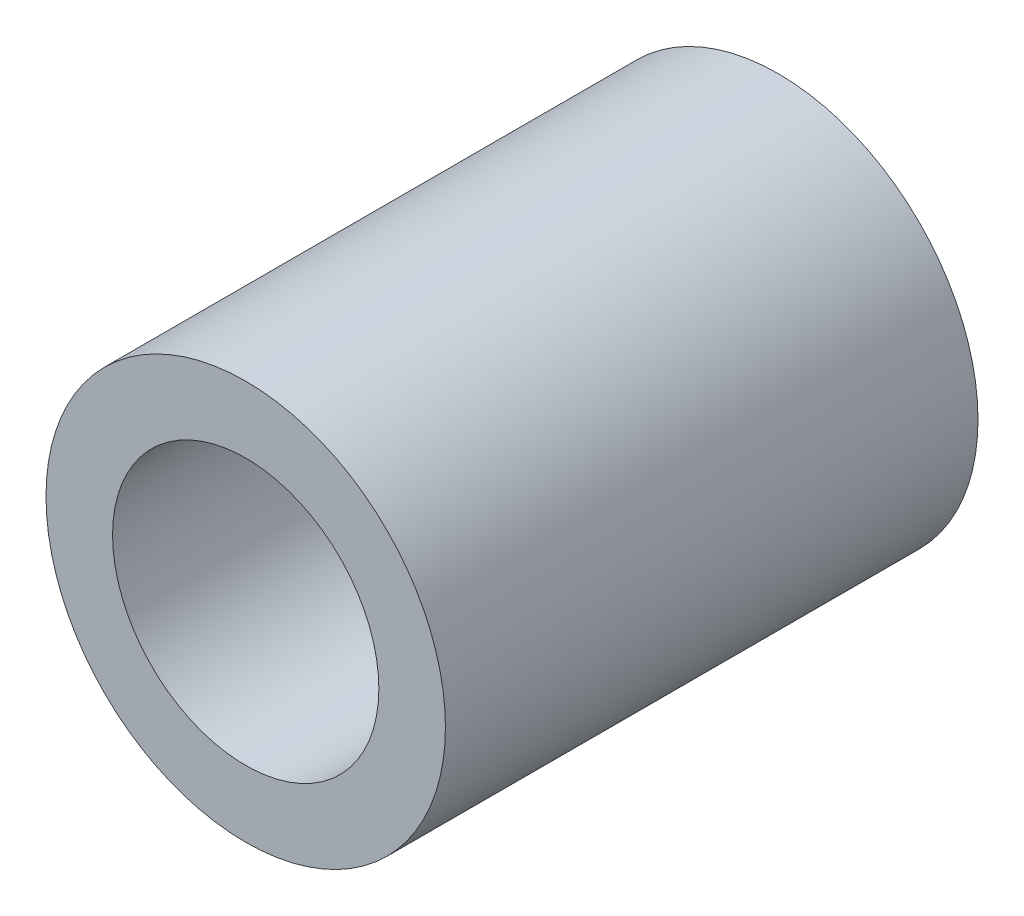
ISO-10303-21;
HEADER;
FILE_DESCRIPTION(('STEP AP214'),'2;1');
FILE_NAME('part.step','',(''),(''),'','','');
FILE_SCHEMA(('AUTOMOTIVE_DESIGN { 1 0 10303 214 1 1 1 1 }'));
ENDSEC;
DATA;
#1=APPLICATION_CONTEXT('core data for automotive mechanical design processes');
#2=APPLICATION_PROTOCOL_DEFINITION('international standard','automotive_design',2000,#1);
#3=PRODUCT_CONTEXT('',#1,'mechanical');
#4=PRODUCT('Part','Part','',(#3));
#5=PRODUCT_RELATED_PRODUCT_CATEGORY('part','',(#4));
#6=PRODUCT_DEFINITION_FORMATION('','',#4);
#7=PRODUCT_DEFINITION_CONTEXT('part definition',#1,'design');
#8=PRODUCT_DEFINITION('design','',#6,#7);
#9=PRODUCT_DEFINITION_SHAPE('','',#8);
#10=(LENGTH_UNIT() NAMED_UNIT(*) SI_UNIT(.MILLI.,.METRE.));
#11=(NAMED_UNIT(*) PLANE_ANGLE_UNIT() SI_UNIT($,.RADIAN.));
#12=(NAMED_UNIT(*) SI_UNIT($,.STERADIAN.) SOLID_ANGLE_UNIT());
#13=UNCERTAINTY_MEASURE_WITH_UNIT(LENGTH_MEASURE(1.E-05),#10,'distance_accuracy_value','');
#14=(GEOMETRIC_REPRESENTATION_CONTEXT(3) GLOBAL_UNCERTAINTY_ASSIGNED_CONTEXT((#13)) GLOBAL_UNIT_ASSIGNED_CONTEXT((#10,
#11,#12)) REPRESENTATION_CONTEXT('',''));
#15=CARTESIAN_POINT('',(0.,0.,0.));
#16=DIRECTION('',(0.,0.,1.));
#17=DIRECTION('',(1.,0.,0.));
#18=AXIS2_PLACEMENT_3D('',#15,#16,#17);
#19=CARTESIAN_POINT('',(0.,0.,50.8));
#20=DIRECTION('',(0.,0.,-1.));
#21=DIRECTION('',(-1.,0.,0.));
#22=AXIS2_PLACEMENT_3D('',#19,#20,#21);
#23=CYLINDRICAL_SURFACE('',#22,19.05);
#24=CARTESIAN_POINT('',(0.,0.,50.8));
#25=DIRECTION('',(0.,0.,1.));
#26=DIRECTION('',(1.,0.,0.));
#27=AXIS2_PLACEMENT_3D('',#24,#25,#26);
#28=CIRCLE('',#27,19.05);
#29=CARTESIAN_POINT('',(19.05,0.,50.8));
#30=VERTEX_POINT('',#29);
#31=EDGE_CURVE('E10',#30,#30,#28,.T.);
#32=ORIENTED_EDGE('',*,*,#31,.F.);
#33=EDGE_LOOP('',(#32));
#34=FACE_BOUND('',#33,.T.);
#35=CARTESIAN_POINT('',(0.,0.,0.));
#36=DIRECTION('',(0.,0.,1.));
#37=DIRECTION('',(1.,0.,0.));
#38=AXIS2_PLACEMENT_3D('',#35,#36,#37);
#39=CIRCLE('',#38,19.05);
#40=CARTESIAN_POINT('',(19.05,0.,0.));
#41=VERTEX_POINT('',#40);
#42=EDGE_CURVE('E44',#41,#41,#39,.T.);
#43=ORIENTED_EDGE('',*,*,#42,.T.);
#44=EDGE_LOOP('',(#43));
#45=FACE_BOUND('',#44,.T.);
#46=ADVANCED_FACE('F41',(#34,#45),#23,.T.);
#47=CARTESIAN_POINT('',(0.,0.,50.8));
#48=DIRECTION('',(0.,0.,1.));
#49=DIRECTION('',(1.,0.,0.));
#50=AXIS2_PLACEMENT_3D('',#47,#48,#49);
#51=PLANE('',#50);
#52=CARTESIAN_POINT('',(0.,0.,50.8));
#53=DIRECTION('',(0.,0.,1.));
#54=DIRECTION('',(1.,0.,0.));
#55=AXIS2_PLACEMENT_3D('',#52,#53,#54);
#56=CIRCLE('',#55,12.7);
#57=CARTESIAN_POINT('',(12.7,0.,50.8));
#58=VERTEX_POINT('',#57);
#59=EDGE_CURVE('E58',#58,#58,#56,.T.);
#60=ORIENTED_EDGE('',*,*,#59,.F.);
#61=EDGE_LOOP('',(#60));
#62=FACE_BOUND('',#61,.T.);
#63=ORIENTED_EDGE('',*,*,#31,.T.);
#64=EDGE_LOOP('',(#63));
#65=FACE_BOUND('',#64,.T.);
#66=ADVANCED_FACE('F66',(#62,#65),#51,.T.);
#67=CARTESIAN_POINT('',(0.,0.,0.));
#68=DIRECTION('',(0.,0.,1.));
#69=DIRECTION('',(1.,0.,0.));
#70=AXIS2_PLACEMENT_3D('',#67,#68,#69);
#71=PLANE('',#70);
#72=CARTESIAN_POINT('',(0.,0.,0.));
#73=DIRECTION('',(0.,0.,1.));
#74=DIRECTION('',(1.,0.,0.));
#75=AXIS2_PLACEMENT_3D('',#72,#73,#74);
#76=CIRCLE('',#75,12.7);
#77=CARTESIAN_POINT('',(12.7,0.,0.));
#78=VERTEX_POINT('',#77);
#79=EDGE_CURVE('E53',#78,#78,#76,.F.);
#80=ORIENTED_EDGE('',*,*,#79,.F.);
#81=EDGE_LOOP('',(#80));
#82=FACE_BOUND('',#81,.T.);
#83=ORIENTED_EDGE('',*,*,#42,.F.);
#84=EDGE_LOOP('',(#83));
#85=FACE_BOUND('',#84,.T.);
#86=ADVANCED_FACE('F68',(#82,#85),#71,.F.);
#87=CARTESIAN_POINT('',(0.,0.,-0.001000000000001));
#88=DIRECTION('',(0.,0.,1.));
#89=DIRECTION('',(1.,0.,0.));
#90=AXIS2_PLACEMENT_3D('',#87,#88,#89);
#91=CYLINDRICAL_SURFACE('',#90,12.7);
#92=ORIENTED_EDGE('',*,*,#59,.T.);
#93=EDGE_LOOP('',(#92));
#94=FACE_BOUND('',#93,.T.);
#95=ORIENTED_EDGE('',*,*,#79,.T.);
#96=EDGE_LOOP('',(#95));
#97=FACE_BOUND('',#96,.T.);
#98=ADVANCED_FACE('F63',(#94,#97),#91,.F.);
#99=CLOSED_SHELL('',(#46,#66,#86,#98));
#100=MANIFOLD_SOLID_BREP('B2',#99);
#101=ADVANCED_BREP_SHAPE_REPRESENTATION('',(#18,#100),#14);
#102=SHAPE_DEFINITION_REPRESENTATION(#9,#101);
ENDSEC;
END-ISO-10303-21;
